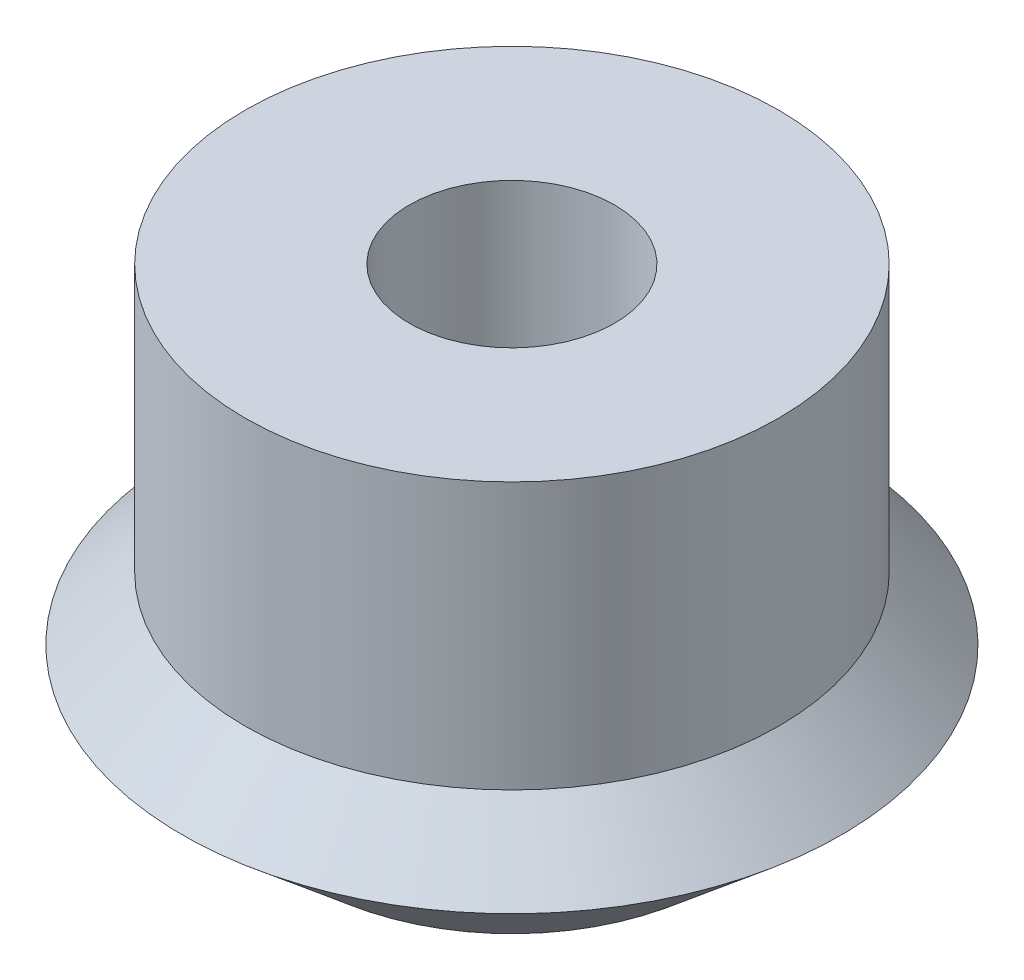
ISO-10303-21;
HEADER;
FILE_DESCRIPTION(('STEP AP214'),'2;1');
FILE_NAME('part.step','',(''),(''),'','','');
FILE_SCHEMA(('AUTOMOTIVE_DESIGN { 1 0 10303 214 1 1 1 1 }'));
ENDSEC;
DATA;
#1=APPLICATION_CONTEXT('core data for automotive mechanical design processes');
#2=APPLICATION_PROTOCOL_DEFINITION('international standard','automotive_design',2000,#1);
#3=PRODUCT_CONTEXT('',#1,'mechanical');
#4=PRODUCT('Part','Part','',(#3));
#5=PRODUCT_RELATED_PRODUCT_CATEGORY('part','',(#4));
#6=PRODUCT_DEFINITION_FORMATION('','',#4);
#7=PRODUCT_DEFINITION_CONTEXT('part definition',#1,'design');
#8=PRODUCT_DEFINITION('design','',#6,#7);
#9=PRODUCT_DEFINITION_SHAPE('','',#8);
#10=(LENGTH_UNIT() NAMED_UNIT(*) SI_UNIT(.MILLI.,.METRE.));
#11=(NAMED_UNIT(*) PLANE_ANGLE_UNIT() SI_UNIT($,.RADIAN.));
#12=(NAMED_UNIT(*) SI_UNIT($,.STERADIAN.) SOLID_ANGLE_UNIT());
#13=UNCERTAINTY_MEASURE_WITH_UNIT(LENGTH_MEASURE(1.E-05),#10,'distance_accuracy_value','');
#14=(GEOMETRIC_REPRESENTATION_CONTEXT(3) GLOBAL_UNCERTAINTY_ASSIGNED_CONTEXT((#13)) GLOBAL_UNIT_ASSIGNED_CONTEXT((#10,
#11,#12)) REPRESENTATION_CONTEXT('',''));
#15=CARTESIAN_POINT('',(0.,0.,0.));
#16=DIRECTION('',(0.,0.,1.));
#17=DIRECTION('',(1.,0.,0.));
#18=AXIS2_PLACEMENT_3D('',#15,#16,#17);
#19=CARTESIAN_POINT('',(0.,-25.3915099009094,-9.24476476164953));
#20=DIRECTION('',(0.,-1.,0.));
#21=DIRECTION('',(0.,0.,-1.));
#22=AXIS2_PLACEMENT_3D('',#19,#20,#21);
#23=CYLINDRICAL_SURFACE('',#22,13.);
#24=CARTESIAN_POINT('',(0.,-11.7435216810073,-9.24476476164953));
#25=DIRECTION('',(0.,-1.,0.));
#26=DIRECTION('',(0.,0.,-1.));
#27=AXIS2_PLACEMENT_3D('',#24,#25,#26);
#28=CIRCLE('',#27,13.);
#29=CARTESIAN_POINT('',(0.,-11.7435216810073,-22.2447647616495));
#30=VERTEX_POINT('',#29);
#31=EDGE_CURVE('E64',#30,#30,#28,.T.);
#32=ORIENTED_EDGE('',*,*,#31,.F.);
#33=EDGE_LOOP('',(#32));
#34=FACE_BOUND('',#33,.T.);
#35=CARTESIAN_POINT('',(0.,1.2564783189927,-9.24476476164953));
#36=DIRECTION('',(0.,-1.,0.));
#37=DIRECTION('',(0.,0.,-1.));
#38=AXIS2_PLACEMENT_3D('',#35,#36,#37);
#39=CIRCLE('',#38,13.);
#40=CARTESIAN_POINT('',(0.,1.2564783189927,-22.2447647616495));
#41=VERTEX_POINT('',#40);
#42=EDGE_CURVE('E10',#41,#41,#39,.T.);
#43=ORIENTED_EDGE('',*,*,#42,.T.);
#44=EDGE_LOOP('',(#43));
#45=FACE_BOUND('',#44,.T.);
#46=ADVANCED_FACE('F39',(#34,#45),#23,.T.);
#47=CARTESIAN_POINT('',(0.,1.2564783189927,-4.24476476164953));
#48=DIRECTION('',(0.,-1.,0.));
#49=DIRECTION('',(0.,0.,-1.));
#50=AXIS2_PLACEMENT_3D('',#47,#48,#49);
#51=PLANE('',#50);
#52=ORIENTED_EDGE('',*,*,#42,.F.);
#53=EDGE_LOOP('',(#52));
#54=FACE_BOUND('',#53,.T.);
#55=CARTESIAN_POINT('',(0.,1.2564783189927,-9.24476476164953));
#56=DIRECTION('',(0.,-1.,0.));
#57=DIRECTION('',(0.,0.,-1.));
#58=AXIS2_PLACEMENT_3D('',#55,#56,#57);
#59=CIRCLE('',#58,5.);
#60=CARTESIAN_POINT('',(0.,1.2564783189927,-14.2447647616495));
#61=VERTEX_POINT('',#60);
#62=EDGE_CURVE('E45',#61,#61,#59,.T.);
#63=ORIENTED_EDGE('',*,*,#62,.T.);
#64=EDGE_LOOP('',(#63));
#65=FACE_BOUND('',#64,.T.);
#66=ADVANCED_FACE('F71',(#54,#65),#51,.F.);
#67=CARTESIAN_POINT('',(0.,-25.3915099009094,-9.24476476164953));
#68=DIRECTION('',(0.,-1.,0.));
#69=DIRECTION('',(0.,0.,-1.));
#70=AXIS2_PLACEMENT_3D('',#67,#68,#69);
#71=CYLINDRICAL_SURFACE('',#70,5.);
#72=ORIENTED_EDGE('',*,*,#62,.F.);
#73=EDGE_LOOP('',(#72));
#74=FACE_BOUND('',#73,.T.);
#75=CARTESIAN_POINT('',(0.,-17.7435216810073,-9.24476476164953));
#76=DIRECTION('',(0.,-1.,0.));
#77=DIRECTION('',(0.,0.,-1.));
#78=AXIS2_PLACEMENT_3D('',#75,#76,#77);
#79=CIRCLE('',#78,5.);
#80=CARTESIAN_POINT('',(0.,-17.7435216810073,-14.2447647616495));
#81=VERTEX_POINT('',#80);
#82=EDGE_CURVE('E49',#81,#81,#79,.T.);
#83=ORIENTED_EDGE('',*,*,#82,.T.);
#84=EDGE_LOOP('',(#83));
#85=FACE_BOUND('',#84,.T.);
#86=ADVANCED_FACE('F75',(#74,#85),#71,.F.);
#87=CARTESIAN_POINT('',(0.,-17.7435216810073,-4.24476476164953));
#88=DIRECTION('',(0.,1.,0.));
#89=DIRECTION('',(0.,0.,1.));
#90=AXIS2_PLACEMENT_3D('',#87,#88,#89);
#91=PLANE('',#90);
#92=ORIENTED_EDGE('',*,*,#82,.F.);
#93=EDGE_LOOP('',(#92));
#94=FACE_BOUND('',#93,.T.);
#95=CARTESIAN_POINT('',(0.,-17.7435216810073,-9.24476476164953));
#96=DIRECTION('',(0.,-1.,0.));
#97=DIRECTION('',(0.,0.,-1.));
#98=AXIS2_PLACEMENT_3D('',#95,#96,#97);
#99=CIRCLE('',#98,7.685);
#100=CARTESIAN_POINT('',(0.,-17.7435216810073,-16.9297647616495));
#101=VERTEX_POINT('',#100);
#102=EDGE_CURVE('E53',#101,#101,#99,.T.);
#103=ORIENTED_EDGE('',*,*,#102,.T.);
#104=EDGE_LOOP('',(#103));
#105=FACE_BOUND('',#104,.T.);
#106=ADVANCED_FACE('F80',(#94,#105),#91,.F.);
#107=CARTESIAN_POINT('',(0.,-19.9671831827989,-9.24476476164953));
#108=DIRECTION('',(0.,-1.,0.));
#109=DIRECTION('',(0.,0.,-1.));
#110=AXIS2_PLACEMENT_3D('',#107,#108,#109);
#111=CONICAL_SURFACE('',#110,9.94963177092289,0.794526161224241);
#112=ORIENTED_EDGE('',*,*,#102,.F.);
#113=EDGE_LOOP('',(#112));
#114=FACE_BOUND('',#113,.T.);
#115=CARTESIAN_POINT('',(0.,-19.9671831827989,-9.24476476164953));
#116=DIRECTION('',(0.,-1.,0.));
#117=DIRECTION('',(0.,0.,-1.));
#118=AXIS2_PLACEMENT_3D('',#115,#116,#117);
#119=CIRCLE('',#118,9.94963177092289);
#120=CARTESIAN_POINT('',(0.,-19.9671831827989,-19.1943965325724));
#121=VERTEX_POINT('',#120);
#122=EDGE_CURVE('E58',#121,#121,#119,.T.);
#123=ORIENTED_EDGE('',*,*,#122,.T.);
#124=EDGE_LOOP('',(#123));
#125=FACE_BOUND('',#124,.T.);
#126=ADVANCED_FACE('F86',(#114,#125),#111,.F.);
#127=CARTESIAN_POINT('',(0.,-14.8035216810072,-9.24476476164953));
#128=DIRECTION('',(0.,1.,0.));
#129=DIRECTION('',(0.,0.,1.));
#130=AXIS2_PLACEMENT_3D('',#127,#128,#129);
#131=CONICAL_SURFACE('',#130,16.06,0.869173967493171);
#132=ORIENTED_EDGE('',*,*,#122,.F.);
#133=EDGE_LOOP('',(#132));
#134=FACE_BOUND('',#133,.T.);
#135=CARTESIAN_POINT('',(0.,-14.8035216810072,-9.24476476164953));
#136=DIRECTION('',(0.,-1.,0.));
#137=DIRECTION('',(0.,0.,-1.));
#138=AXIS2_PLACEMENT_3D('',#135,#136,#137);
#139=CIRCLE('',#138,16.06);
#140=CARTESIAN_POINT('',(0.,-14.8035216810072,-25.3047647616495));
#141=VERTEX_POINT('',#140);
#142=EDGE_CURVE('E61',#141,#141,#139,.T.);
#143=ORIENTED_EDGE('',*,*,#142,.T.);
#144=EDGE_LOOP('',(#143));
#145=FACE_BOUND('',#144,.T.);
#146=ADVANCED_FACE('F90',(#134,#145),#131,.T.);
#147=CARTESIAN_POINT('',(0.,-11.7435216810073,-9.24476476164953));
#148=DIRECTION('',(0.,-1.,0.));
#149=DIRECTION('',(0.,0.,-1.));
#150=AXIS2_PLACEMENT_3D('',#147,#148,#149);
#151=CONICAL_SURFACE('',#150,13.,0.785398163397458);
#152=ORIENTED_EDGE('',*,*,#142,.F.);
#153=EDGE_LOOP('',(#152));
#154=FACE_BOUND('',#153,.T.);
#155=ORIENTED_EDGE('',*,*,#31,.T.);
#156=EDGE_LOOP('',(#155));
#157=FACE_BOUND('',#156,.T.);
#158=ADVANCED_FACE('F68',(#154,#157),#151,.T.);
#159=CLOSED_SHELL('',(#46,#66,#86,#106,#126,#146,#158));
#160=MANIFOLD_SOLID_BREP('B2',#159);
#161=ADVANCED_BREP_SHAPE_REPRESENTATION('',(#18,#160),#14);
#162=SHAPE_DEFINITION_REPRESENTATION(#9,#161);
ENDSEC;
END-ISO-10303-21;
